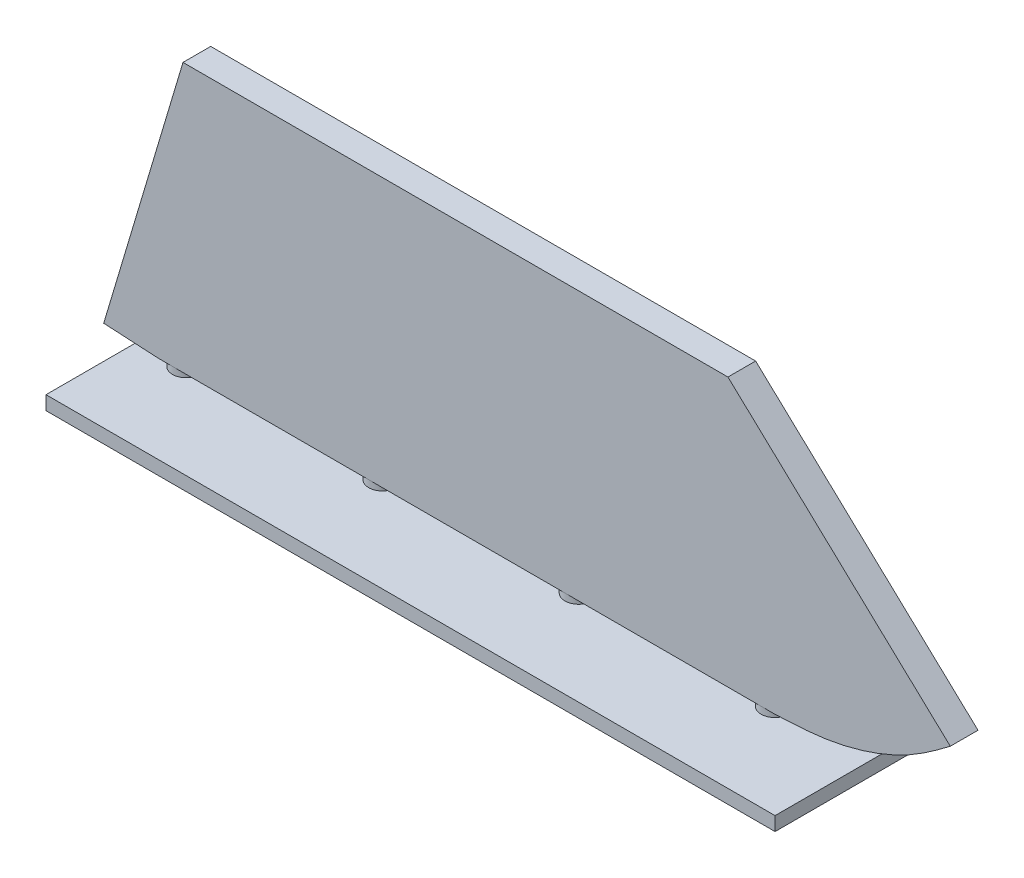
ISO-10303-21;
HEADER;
FILE_DESCRIPTION(('STEP AP214'),'2;1');
FILE_NAME('part.step','',(''),(''),'','','');
FILE_SCHEMA(('AUTOMOTIVE_DESIGN { 1 0 10303 214 1 1 1 1 }'));
ENDSEC;
DATA;
#1=APPLICATION_CONTEXT('core data for automotive mechanical design processes');
#2=APPLICATION_PROTOCOL_DEFINITION('international standard','automotive_design',2000,#1);
#3=PRODUCT_CONTEXT('',#1,'mechanical');
#4=PRODUCT('Part','Part','',(#3));
#5=PRODUCT_RELATED_PRODUCT_CATEGORY('part','',(#4));
#6=PRODUCT_DEFINITION_FORMATION('','',#4);
#7=PRODUCT_DEFINITION_CONTEXT('part definition',#1,'design');
#8=PRODUCT_DEFINITION('design','',#6,#7);
#9=PRODUCT_DEFINITION_SHAPE('','',#8);
#10=(LENGTH_UNIT() NAMED_UNIT(*) SI_UNIT(.MILLI.,.METRE.));
#11=(NAMED_UNIT(*) PLANE_ANGLE_UNIT() SI_UNIT($,.RADIAN.));
#12=(NAMED_UNIT(*) SI_UNIT($,.STERADIAN.) SOLID_ANGLE_UNIT());
#13=UNCERTAINTY_MEASURE_WITH_UNIT(LENGTH_MEASURE(1.E-05),#10,'distance_accuracy_value','');
#14=(GEOMETRIC_REPRESENTATION_CONTEXT(3) GLOBAL_UNCERTAINTY_ASSIGNED_CONTEXT((#13)) GLOBAL_UNIT_ASSIGNED_CONTEXT((#10,
#11,#12)) REPRESENTATION_CONTEXT('',''));
#15=CARTESIAN_POINT('',(0.,0.,0.));
#16=DIRECTION('',(0.,0.,1.));
#17=DIRECTION('',(1.,0.,0.));
#18=AXIS2_PLACEMENT_3D('',#15,#16,#17);
#19=CARTESIAN_POINT('',(14.9148997355209,-5.81721391101612,0.));
#20=DIRECTION('',(0.,-1.,0.));
#21=DIRECTION('',(0.,0.,-1.));
#22=AXIS2_PLACEMENT_3D('',#19,#20,#21);
#23=PLANE('',#22);
#24=DIRECTION('',(1.,0.,0.));
#25=VECTOR('',#24,1.);
#26=CARTESIAN_POINT('',(14.9148997355209,-5.81721391101612,0.));
#27=LINE('',#26,#25);
#28=CARTESIAN_POINT('',(1.60891549915735,-5.81721391101612,0.));
#29=VERTEX_POINT('',#28);
#30=CARTESIAN_POINT('',(10.1089154991573,-5.81721391101612,0.));
#31=VERTEX_POINT('',#30);
#32=EDGE_CURVE('E333',#29,#31,#27,.T.);
#33=ORIENTED_EDGE('',*,*,#32,.T.);
#34=CARTESIAN_POINT('',(10.1089154991573,-5.81721391101612,0.6));
#35=DIRECTION('',(0.,-1.,0.));
#36=DIRECTION('',(0.,0.,-1.));
#37=AXIS2_PLACEMENT_3D('',#34,#35,#36);
#38=CIRCLE('',#37,0.6);
#39=CARTESIAN_POINT('',(10.1089154991573,-5.81721391101612,1.2));
#40=VERTEX_POINT('',#39);
#41=EDGE_CURVE('E113',#40,#31,#38,.T.);
#42=ORIENTED_EDGE('',*,*,#41,.F.);
#43=DIRECTION('',(1.,0.,0.));
#44=VECTOR('',#43,1.);
#45=CARTESIAN_POINT('',(14.9148997355209,-5.81721391101612,1.2));
#46=LINE('',#45,#44);
#47=CARTESIAN_POINT('',(1.60891549915735,-5.81721391101612,1.2));
#48=VERTEX_POINT('',#47);
#49=EDGE_CURVE('E430',#48,#40,#46,.T.);
#50=ORIENTED_EDGE('',*,*,#49,.F.);
#51=CARTESIAN_POINT('',(1.60891549915735,-5.81721391101612,0.6));
#52=DIRECTION('',(0.,-1.,0.));
#53=DIRECTION('',(0.,0.,-1.));
#54=AXIS2_PLACEMENT_3D('',#51,#52,#53);
#55=CIRCLE('',#54,0.6);
#56=EDGE_CURVE('E245',#29,#48,#55,.T.);
#57=ORIENTED_EDGE('',*,*,#56,.F.);
#58=EDGE_LOOP('',(#33,#42,#50,#57));
#59=FACE_BOUND('',#58,.T.);
#60=ADVANCED_FACE('F95',(#59),#23,.T.);
#61=CARTESIAN_POINT('',(-6.89108450084265,-5.81721391101612,0.));
#62=VERTEX_POINT('',#61);
#63=EDGE_CURVE('E341',#62,#29,#27,.T.);
#64=ORIENTED_EDGE('',*,*,#63,.T.);
#65=EDGE_CURVE('E120',#48,#29,#55,.T.);
#66=ORIENTED_EDGE('',*,*,#65,.F.);
#67=CARTESIAN_POINT('',(-6.89108450084265,-5.81721391101612,1.2));
#68=VERTEX_POINT('',#67);
#69=EDGE_CURVE('E428',#68,#48,#46,.T.);
#70=ORIENTED_EDGE('',*,*,#69,.F.);
#71=CARTESIAN_POINT('',(-6.89108450084265,-5.81721391101612,0.6));
#72=DIRECTION('',(0.,-1.,0.));
#73=DIRECTION('',(0.,0.,-1.));
#74=AXIS2_PLACEMENT_3D('',#71,#72,#73);
#75=CIRCLE('',#74,0.6);
#76=EDGE_CURVE('E252',#62,#68,#75,.T.);
#77=ORIENTED_EDGE('',*,*,#76,.F.);
#78=EDGE_LOOP('',(#64,#66,#70,#77));
#79=FACE_BOUND('',#78,.T.);
#80=ADVANCED_FACE('F324',(#79),#23,.T.);
#81=CARTESIAN_POINT('',(-15.3910845008427,-5.81721391101612,0.));
#82=VERTEX_POINT('',#81);
#83=EDGE_CURVE('E279',#82,#62,#27,.T.);
#84=ORIENTED_EDGE('',*,*,#83,.T.);
#85=EDGE_CURVE('E255',#68,#62,#75,.T.);
#86=ORIENTED_EDGE('',*,*,#85,.F.);
#87=CARTESIAN_POINT('',(-15.3910845008427,-5.81721391101612,1.2));
#88=VERTEX_POINT('',#87);
#89=EDGE_CURVE('E382',#88,#68,#46,.T.);
#90=ORIENTED_EDGE('',*,*,#89,.F.);
#91=CARTESIAN_POINT('',(-15.3910845008427,-5.81721391101612,0.6));
#92=DIRECTION('',(0.,-1.,0.));
#93=DIRECTION('',(0.,0.,-1.));
#94=AXIS2_PLACEMENT_3D('',#91,#92,#93);
#95=CIRCLE('',#94,0.6);
#96=EDGE_CURVE('E107',#82,#88,#95,.T.);
#97=ORIENTED_EDGE('',*,*,#96,.F.);
#98=EDGE_LOOP('',(#84,#86,#90,#97));
#99=FACE_BOUND('',#98,.T.);
#100=ADVANCED_FACE('F329',(#99),#23,.T.);
#101=CARTESIAN_POINT('',(10.7230109650848,-5.81721391101612,1.2));
#102=VERTEX_POINT('',#101);
#103=EDGE_CURVE('E377',#40,#102,#46,.T.);
#104=ORIENTED_EDGE('',*,*,#103,.F.);
#105=EDGE_CURVE('E241',#31,#40,#38,.T.);
#106=ORIENTED_EDGE('',*,*,#105,.F.);
#107=CARTESIAN_POINT('',(10.7230109650848,-5.81721391101612,0.));
#108=VERTEX_POINT('',#107);
#109=EDGE_CURVE('E274',#31,#108,#27,.T.);
#110=ORIENTED_EDGE('',*,*,#109,.T.);
#111=DIRECTION('',(0.,0.,1.));
#112=VECTOR('',#111,1.);
#113=CARTESIAN_POINT('',(10.7230109650848,-5.81721391101612,0.));
#114=LINE('',#113,#112);
#115=EDGE_CURVE('E348',#108,#102,#114,.T.);
#116=ORIENTED_EDGE('',*,*,#115,.T.);
#117=EDGE_LOOP('',(#104,#106,#110,#116));
#118=FACE_BOUND('',#117,.T.);
#119=ADVANCED_FACE('F347',(#118),#23,.T.);
#120=CARTESIAN_POINT('',(-15.9910845008427,-5.81721391101612,0.6));
#121=VERTEX_POINT('',#120);
#122=EDGE_CURVE('E12',#88,#121,#95,.T.);
#123=ORIENTED_EDGE('',*,*,#122,.F.);
#124=CARTESIAN_POINT('',(-15.9910845008427,-5.81721391101612,1.2));
#125=VERTEX_POINT('',#124);
#126=EDGE_CURVE('E378',#125,#88,#46,.T.);
#127=ORIENTED_EDGE('',*,*,#126,.F.);
#128=DIRECTION('',(0.,0.,1.));
#129=VECTOR('',#128,1.);
#130=CARTESIAN_POINT('',(-15.9910845008427,-5.81721391101612,0.));
#131=LINE('',#130,#129);
#132=EDGE_CURVE('E369',#121,#125,#131,.T.);
#133=ORIENTED_EDGE('',*,*,#132,.F.);
#134=EDGE_LOOP('',(#123,#127,#133));
#135=FACE_BOUND('',#134,.T.);
#136=ADVANCED_FACE('F304',(#135),#23,.T.);
#137=CARTESIAN_POINT('',(14.9148997355209,-5.56824616303646,0.));
#138=DIRECTION('',(0.,0.,-1.));
#139=DIRECTION('',(-1.,0.,0.));
#140=AXIS2_PLACEMENT_3D('',#137,#138,#139);
#141=PLANE('',#140);
#142=DIRECTION('',(0.99850798449248,-0.0546059054019313,0.));
#143=VECTOR('',#142,1.);
#144=CARTESIAN_POINT('',(14.8091692949579,-7.50160279047393,0.));
#145=LINE('',#144,#143);
#146=CARTESIAN_POINT('',(-18.3712113295862,-5.68705072506922,0.));
#147=VERTEX_POINT('',#146);
#148=CARTESIAN_POINT('',(-15.9910845008427,-5.81721391101612,0.));
#149=VERTEX_POINT('',#148);
#150=EDGE_CURVE('E269',#147,#149,#145,.T.);
#151=ORIENTED_EDGE('',*,*,#150,.F.);
#152=DIRECTION('',(-0.286097759922415,-0.958200434025876,0.));
#153=VECTOR('',#152,1.);
#154=CARTESIAN_POINT('',(-15.6141099919803,3.5470505802458,0.));
#155=LINE('',#154,#153);
#156=CARTESIAN_POINT('',(-14.9362887131247,5.81721391101613,0.));
#157=VERTEX_POINT('',#156);
#158=EDGE_CURVE('E266',#157,#147,#155,.T.);
#159=ORIENTED_EDGE('',*,*,#158,.F.);
#160=DIRECTION('',(-1.,0.,0.));
#161=VECTOR('',#160,1.);
#162=CARTESIAN_POINT('',(14.9148997355209,5.81721391101612,0.));
#163=LINE('',#162,#161);
#164=CARTESIAN_POINT('',(8.67152041767164,5.81721391101612,0.));
#165=VERTEX_POINT('',#164);
#166=EDGE_CURVE('E363',#165,#157,#163,.T.);
#167=ORIENTED_EDGE('',*,*,#166,.F.);
#168=DIRECTION('',(-0.729323810427005,0.68416867769888,0.));
#169=VECTOR('',#168,1.);
#170=CARTESIAN_POINT('',(17.6735790572682,-2.62749400605383,0.));
#171=LINE('',#170,#169);
#172=CARTESIAN_POINT('',(18.3045013913401,-3.21935360649656,0.));
#173=VERTEX_POINT('',#172);
#174=EDGE_CURVE('E286',#173,#165,#171,.T.);
#175=ORIENTED_EDGE('',*,*,#174,.F.);
#176=CARTESIAN_POINT('',(10.7230109650848,-5.81721391101612,0.));
#177=CARTESIAN_POINT('',(11.4066449119743,-5.78645110556188,0.));
#178=CARTESIAN_POINT('',(12.0903144956894,-5.75613160349603,0.));
#179=CARTESIAN_POINT('',(13.4476523289835,-5.57108125666555,0.));
#180=CARTESIAN_POINT('',(14.109804635552,-5.41365512562631,0.));
#181=CARTESIAN_POINT('',(15.0717412312482,-5.09497810633691,0.));
#182=CARTESIAN_POINT('',(15.3878153285094,-4.97510237980859,0.));
#183=CARTESIAN_POINT('',(16.0093075854465,-4.70353288078843,0.));
#184=CARTESIAN_POINT('',(16.3157511566924,-4.55123457448258,0.));
#185=CARTESIAN_POINT('',(17.2086095004276,-4.04008588116487,0.));
#186=CARTESIAN_POINT('',(17.7569931684555,-3.63036393372277,0.));
#187=CARTESIAN_POINT('',(18.3045013913401,-3.21935360649655,0.));
#188=B_SPLINE_CURVE_WITH_KNOTS('',3,(#176,#177,#178,#179,#180,#181,#182,#183,#184,#185,#186,
#187),.UNSPECIFIED.,.F.,.F.,(4,2,2,2,2,4),(0.,0.25,0.5,0.625,0.75,1.),.UNSPECIFIED.);
#189=EDGE_CURVE('E278',#108,#173,#188,.T.);
#190=ORIENTED_EDGE('',*,*,#189,.F.);
#191=ORIENTED_EDGE('',*,*,#109,.F.);
#192=ORIENTED_EDGE('',*,*,#32,.F.);
#193=ORIENTED_EDGE('',*,*,#63,.F.);
#194=ORIENTED_EDGE('',*,*,#83,.F.);
#195=EDGE_CURVE('E275',#149,#82,#27,.T.);
#196=ORIENTED_EDGE('',*,*,#195,.F.);
#197=EDGE_LOOP('',(#151,#159,#167,#175,#190,#191,#192,#193,#194,#196));
#198=FACE_BOUND('',#197,.T.);
#199=ADVANCED_FACE('F97',(#198),#141,.T.);
#200=CARTESIAN_POINT('',(-15.6141099919803,3.5470505802458,0.));
#201=DIRECTION('',(-0.958200434025875,0.286097759922415,0.));
#202=DIRECTION('',(-0.286097759922415,-0.958200434025876,0.));
#203=AXIS2_PLACEMENT_3D('',#200,#201,#202);
#204=PLANE('',#203);
#205=DIRECTION('',(-0.286097759922415,-0.958200434025876,0.));
#206=VECTOR('',#205,1.);
#207=CARTESIAN_POINT('',(-15.6141099919803,3.5470505802458,1.2));
#208=LINE('',#207,#206);
#209=CARTESIAN_POINT('',(-14.9362887131247,5.81721391101613,1.2));
#210=VERTEX_POINT('',#209);
#211=CARTESIAN_POINT('',(-18.3712113295862,-5.68705072506922,1.2));
#212=VERTEX_POINT('',#211);
#213=EDGE_CURVE('E262',#210,#212,#208,.T.);
#214=ORIENTED_EDGE('',*,*,#213,.F.);
#215=DIRECTION('',(0.,0.,1.));
#216=VECTOR('',#215,1.);
#217=CARTESIAN_POINT('',(-14.9362887131247,5.81721391101613,0.));
#218=LINE('',#217,#216);
#219=EDGE_CURVE('E397',#157,#210,#218,.T.);
#220=ORIENTED_EDGE('',*,*,#219,.F.);
#221=ORIENTED_EDGE('',*,*,#158,.T.);
#222=DIRECTION('',(0.,0.,1.));
#223=VECTOR('',#222,1.);
#224=CARTESIAN_POINT('',(-18.3712113295862,-5.68705072506922,0.));
#225=LINE('',#224,#223);
#226=EDGE_CURVE('E99',#147,#212,#225,.T.);
#227=ORIENTED_EDGE('',*,*,#226,.T.);
#228=EDGE_LOOP('',(#214,#220,#221,#227));
#229=FACE_BOUND('',#228,.T.);
#230=ADVANCED_FACE('F309',(#229),#204,.T.);
#231=CARTESIAN_POINT('',(14.9148997355209,5.81721391101612,0.));
#232=DIRECTION('',(0.,1.,0.));
#233=DIRECTION('',(-1.,0.,0.));
#234=AXIS2_PLACEMENT_3D('',#231,#232,#233);
#235=PLANE('',#234);
#236=DIRECTION('',(-1.,0.,0.));
#237=VECTOR('',#236,1.);
#238=CARTESIAN_POINT('',(14.9148997355209,5.81721391101612,1.2));
#239=LINE('',#238,#237);
#240=CARTESIAN_POINT('',(8.67152041767164,5.81721391101612,1.2));
#241=VERTEX_POINT('',#240);
#242=EDGE_CURVE('E270',#241,#210,#239,.T.);
#243=ORIENTED_EDGE('',*,*,#242,.F.);
#244=DIRECTION('',(0.,0.,1.));
#245=VECTOR('',#244,1.);
#246=CARTESIAN_POINT('',(8.67152041767164,5.81721391101612,0.));
#247=LINE('',#246,#245);
#248=EDGE_CURVE('E400',#165,#241,#247,.T.);
#249=ORIENTED_EDGE('',*,*,#248,.F.);
#250=ORIENTED_EDGE('',*,*,#166,.T.);
#251=ORIENTED_EDGE('',*,*,#219,.T.);
#252=EDGE_LOOP('',(#243,#249,#250,#251));
#253=FACE_BOUND('',#252,.T.);
#254=ADVANCED_FACE('F311',(#253),#235,.T.);
#255=CARTESIAN_POINT('',(17.6735790572682,-2.62749400605383,0.));
#256=DIRECTION('',(0.68416867769888,0.729323810427005,0.));
#257=DIRECTION('',(-0.729323810427005,0.68416867769888,0.));
#258=AXIS2_PLACEMENT_3D('',#255,#256,#257);
#259=PLANE('',#258);
#260=DIRECTION('',(-0.729323810427005,0.68416867769888,0.));
#261=VECTOR('',#260,1.);
#262=CARTESIAN_POINT('',(17.6735790572682,-2.62749400605383,1.2));
#263=LINE('',#262,#261);
#264=CARTESIAN_POINT('',(18.3045013913401,-3.21935360649656,1.2));
#265=VERTEX_POINT('',#264);
#266=EDGE_CURVE('E387',#265,#241,#263,.T.);
#267=ORIENTED_EDGE('',*,*,#266,.F.);
#268=DIRECTION('',(0.,0.,1.));
#269=VECTOR('',#268,1.);
#270=CARTESIAN_POINT('',(18.3045013913401,-3.21935360649656,0.));
#271=LINE('',#270,#269);
#272=EDGE_CURVE('E355',#173,#265,#271,.T.);
#273=ORIENTED_EDGE('',*,*,#272,.F.);
#274=ORIENTED_EDGE('',*,*,#174,.T.);
#275=ORIENTED_EDGE('',*,*,#248,.T.);
#276=EDGE_LOOP('',(#267,#273,#274,#275));
#277=FACE_BOUND('',#276,.T.);
#278=ADVANCED_FACE('F297',(#277),#259,.T.);
#279=DIRECTION('',(0.,0.,1.));
#280=VECTOR('',#279,1.);
#281=SURFACE_OF_LINEAR_EXTRUSION('',#188,#280);
#282=CARTESIAN_POINT('',(10.7230109650848,-5.81721391101612,1.2));
#283=CARTESIAN_POINT('',(11.4066449119743,-5.78645110556188,1.2));
#284=CARTESIAN_POINT('',(12.0903144956894,-5.75613160349603,1.2));
#285=CARTESIAN_POINT('',(13.4476523289835,-5.57108125666555,1.2));
#286=CARTESIAN_POINT('',(14.109804635552,-5.41365512562631,1.2));
#287=CARTESIAN_POINT('',(15.0717412312482,-5.09497810633691,1.2));
#288=CARTESIAN_POINT('',(15.3878153285094,-4.97510237980859,1.2));
#289=CARTESIAN_POINT('',(16.0093075854465,-4.70353288078843,1.2));
#290=CARTESIAN_POINT('',(16.3157511566924,-4.55123457448258,1.2));
#291=CARTESIAN_POINT('',(17.2086095004276,-4.04008588116487,1.2));
#292=CARTESIAN_POINT('',(17.7569931684555,-3.63036393372277,1.2));
#293=CARTESIAN_POINT('',(18.3045013913401,-3.21935360649655,1.2));
#294=B_SPLINE_CURVE_WITH_KNOTS('',3,(#282,#283,#284,#285,#286,#287,#288,#289,#290,#291,#292,
#293),.UNSPECIFIED.,.F.,.F.,(4,2,2,2,2,4),(0.,0.25,0.5,0.625,0.75,1.),.UNSPECIFIED.);
#295=EDGE_CURVE('E353',#102,#265,#294,.T.);
#296=ORIENTED_EDGE('',*,*,#295,.F.);
#297=ORIENTED_EDGE('',*,*,#115,.F.);
#298=ORIENTED_EDGE('',*,*,#189,.T.);
#299=ORIENTED_EDGE('',*,*,#272,.T.);
#300=EDGE_LOOP('',(#296,#297,#298,#299));
#301=FACE_BOUND('',#300,.T.);
#302=ADVANCED_FACE('F292',(#301),#281,.T.);
#303=EDGE_CURVE('E105',#121,#82,#95,.T.);
#304=ORIENTED_EDGE('',*,*,#303,.F.);
#305=EDGE_CURVE('E356',#149,#121,#131,.T.);
#306=ORIENTED_EDGE('',*,*,#305,.F.);
#307=ORIENTED_EDGE('',*,*,#195,.T.);
#308=EDGE_LOOP('',(#304,#306,#307));
#309=FACE_BOUND('',#308,.T.);
#310=ADVANCED_FACE('F296',(#309),#23,.T.);
#311=CARTESIAN_POINT('',(14.8091692949579,-7.50160279047393,0.));
#312=DIRECTION('',(-0.0546059054019313,-0.99850798449248,0.));
#313=DIRECTION('',(0.99850798449248,-0.0546059054019313,0.));
#314=AXIS2_PLACEMENT_3D('',#311,#312,#313);
#315=PLANE('',#314);
#316=DIRECTION('',(0.99850798449248,-0.0546059054019313,0.));
#317=VECTOR('',#316,1.);
#318=CARTESIAN_POINT('',(14.8091692949579,-7.50160279047393,1.2));
#319=LINE('',#318,#317);
#320=EDGE_CURVE('E373',#212,#125,#319,.T.);
#321=ORIENTED_EDGE('',*,*,#320,.F.);
#322=ORIENTED_EDGE('',*,*,#226,.F.);
#323=ORIENTED_EDGE('',*,*,#150,.T.);
#324=ORIENTED_EDGE('',*,*,#305,.T.);
#325=ORIENTED_EDGE('',*,*,#132,.T.);
#326=EDGE_LOOP('',(#321,#322,#323,#324,#325));
#327=FACE_BOUND('',#326,.T.);
#328=ADVANCED_FACE('F302',(#327),#315,.T.);
#329=CARTESIAN_POINT('',(14.9148997355209,-5.56824616303646,1.2));
#330=DIRECTION('',(0.,0.,-1.));
#331=DIRECTION('',(-1.,0.,0.));
#332=AXIS2_PLACEMENT_3D('',#329,#330,#331);
#333=PLANE('',#332);
#334=ORIENTED_EDGE('',*,*,#213,.T.);
#335=ORIENTED_EDGE('',*,*,#320,.T.);
#336=ORIENTED_EDGE('',*,*,#126,.T.);
#337=ORIENTED_EDGE('',*,*,#89,.T.);
#338=ORIENTED_EDGE('',*,*,#69,.T.);
#339=ORIENTED_EDGE('',*,*,#49,.T.);
#340=ORIENTED_EDGE('',*,*,#103,.T.);
#341=ORIENTED_EDGE('',*,*,#295,.T.);
#342=ORIENTED_EDGE('',*,*,#266,.T.);
#343=ORIENTED_EDGE('',*,*,#242,.T.);
#344=EDGE_LOOP('',(#334,#335,#336,#337,#338,#339,#340,#341,#342,#343));
#345=FACE_BOUND('',#344,.T.);
#346=ADVANCED_FACE('F307',(#345),#333,.F.);
#347=CARTESIAN_POINT('',(-15.3910845008427,-6.11721391101612,0.6));
#348=DIRECTION('',(0.,1.,0.));
#349=DIRECTION('',(0.,0.,1.));
#350=AXIS2_PLACEMENT_3D('',#347,#348,#349);
#351=CYLINDRICAL_SURFACE('',#350,0.6);
#352=CARTESIAN_POINT('',(-15.3910845008427,-6.11721391101612,0.6));
#353=DIRECTION('',(0.,-1.,0.));
#354=DIRECTION('',(0.,0.,-1.));
#355=AXIS2_PLACEMENT_3D('',#352,#353,#354);
#356=CIRCLE('',#355,0.6);
#357=CARTESIAN_POINT('',(-15.3910845008427,-6.11721391101612,0.));
#358=VERTEX_POINT('',#357);
#359=EDGE_CURVE('E259',#358,#358,#356,.T.);
#360=ORIENTED_EDGE('',*,*,#359,.F.);
#361=EDGE_LOOP('',(#360));
#362=FACE_BOUND('',#361,.T.);
#363=ORIENTED_EDGE('',*,*,#96,.T.);
#364=ORIENTED_EDGE('',*,*,#122,.T.);
#365=ORIENTED_EDGE('',*,*,#303,.T.);
#366=EDGE_LOOP('',(#363,#364,#365));
#367=FACE_BOUND('',#366,.T.);
#368=ADVANCED_FACE('F314',(#362,#367),#351,.T.);
#369=CARTESIAN_POINT('',(-6.89108450084265,-6.11721391101612,0.6));
#370=DIRECTION('',(0.,1.,0.));
#371=DIRECTION('',(0.,0.,1.));
#372=AXIS2_PLACEMENT_3D('',#369,#370,#371);
#373=CYLINDRICAL_SURFACE('',#372,0.6);
#374=CARTESIAN_POINT('',(-6.89108450084265,-6.11721391101612,0.6));
#375=DIRECTION('',(0.,-1.,0.));
#376=DIRECTION('',(0.,0.,-1.));
#377=AXIS2_PLACEMENT_3D('',#374,#375,#376);
#378=CIRCLE('',#377,0.6);
#379=CARTESIAN_POINT('',(-6.89108450084265,-6.11721391101612,0.));
#380=VERTEX_POINT('',#379);
#381=EDGE_CURVE('E248',#380,#380,#378,.T.);
#382=ORIENTED_EDGE('',*,*,#381,.F.);
#383=EDGE_LOOP('',(#382));
#384=FACE_BOUND('',#383,.T.);
#385=ORIENTED_EDGE('',*,*,#76,.T.);
#386=ORIENTED_EDGE('',*,*,#85,.T.);
#387=EDGE_LOOP('',(#385,#386));
#388=FACE_BOUND('',#387,.T.);
#389=ADVANCED_FACE('F319',(#384,#388),#373,.T.);
#390=CARTESIAN_POINT('',(1.60891549915735,-6.11721391101612,0.6));
#391=DIRECTION('',(0.,1.,0.));
#392=DIRECTION('',(0.,0.,1.));
#393=AXIS2_PLACEMENT_3D('',#390,#391,#392);
#394=CYLINDRICAL_SURFACE('',#393,0.6);
#395=CARTESIAN_POINT('',(1.60891549915735,-6.11721391101612,0.6));
#396=DIRECTION('',(0.,-1.,0.));
#397=DIRECTION('',(0.,0.,-1.));
#398=AXIS2_PLACEMENT_3D('',#395,#396,#397);
#399=CIRCLE('',#398,0.6);
#400=CARTESIAN_POINT('',(1.60891549915735,-6.11721391101612,0.));
#401=VERTEX_POINT('',#400);
#402=EDGE_CURVE('E243',#401,#401,#399,.T.);
#403=ORIENTED_EDGE('',*,*,#402,.F.);
#404=EDGE_LOOP('',(#403));
#405=FACE_BOUND('',#404,.T.);
#406=ORIENTED_EDGE('',*,*,#56,.T.);
#407=ORIENTED_EDGE('',*,*,#65,.T.);
#408=EDGE_LOOP('',(#406,#407));
#409=FACE_BOUND('',#408,.T.);
#410=ADVANCED_FACE('F442',(#405,#409),#394,.T.);
#411=CARTESIAN_POINT('',(10.1089154991573,-6.11721391101612,0.6));
#412=DIRECTION('',(0.,1.,0.));
#413=DIRECTION('',(0.,0.,1.));
#414=AXIS2_PLACEMENT_3D('',#411,#412,#413);
#415=CYLINDRICAL_SURFACE('',#414,0.6);
#416=CARTESIAN_POINT('',(10.1089154991573,-6.11721391101612,0.6));
#417=DIRECTION('',(0.,-1.,0.));
#418=DIRECTION('',(0.,0.,-1.));
#419=AXIS2_PLACEMENT_3D('',#416,#417,#418);
#420=CIRCLE('',#419,0.6);
#421=CARTESIAN_POINT('',(10.1089154991573,-6.11721391101612,0.));
#422=VERTEX_POINT('',#421);
#423=EDGE_CURVE('E231',#422,#422,#420,.T.);
#424=ORIENTED_EDGE('',*,*,#423,.F.);
#425=EDGE_LOOP('',(#424));
#426=FACE_BOUND('',#425,.T.);
#427=ORIENTED_EDGE('',*,*,#105,.T.);
#428=ORIENTED_EDGE('',*,*,#41,.T.);
#429=EDGE_LOOP('',(#427,#428));
#430=FACE_BOUND('',#429,.T.);
#431=ADVANCED_FACE('F446',(#426,#430),#415,.T.);
#432=CARTESIAN_POINT('',(-17.3714029187408,-6.71721391101612,4.69968671872242));
#433=DIRECTION('',(1.,0.,0.));
#434=DIRECTION('',(0.,0.,-1.));
#435=AXIS2_PLACEMENT_3D('',#432,#433,#434);
#436=PLANE('',#435);
#437=DIRECTION('',(0.,0.,-1.));
#438=VECTOR('',#437,1.);
#439=CARTESIAN_POINT('',(-17.3714029187408,-6.11721391101612,4.69968671872242));
#440=LINE('',#439,#438);
#441=CARTESIAN_POINT('',(-17.3714029187408,-6.11721391101612,4.69968671872242));
#442=VERTEX_POINT('',#441);
#443=CARTESIAN_POINT('',(-17.3714029187408,-6.11721391101612,-3.10099333914593));
#444=VERTEX_POINT('',#443);
#445=EDGE_CURVE('E229',#442,#444,#440,.T.);
#446=ORIENTED_EDGE('',*,*,#445,.T.);
#447=DIRECTION('',(0.,1.,0.));
#448=VECTOR('',#447,1.);
#449=CARTESIAN_POINT('',(-17.3714029187408,-6.71721391101612,-3.10099333914593));
#450=LINE('',#449,#448);
#451=CARTESIAN_POINT('',(-17.3714029187408,-6.71721391101612,-3.10099333914593));
#452=VERTEX_POINT('',#451);
#453=EDGE_CURVE('E207',#452,#444,#450,.T.);
#454=ORIENTED_EDGE('',*,*,#453,.F.);
#455=DIRECTION('',(0.,0.,-1.));
#456=VECTOR('',#455,1.);
#457=CARTESIAN_POINT('',(-17.3714029187408,-6.71721391101612,4.69968671872242));
#458=LINE('',#457,#456);
#459=CARTESIAN_POINT('',(-17.3714029187408,-6.71721391101612,4.69968671872242));
#460=VERTEX_POINT('',#459);
#461=EDGE_CURVE('E215',#460,#452,#458,.T.);
#462=ORIENTED_EDGE('',*,*,#461,.F.);
#463=DIRECTION('',(0.,1.,0.));
#464=VECTOR('',#463,1.);
#465=CARTESIAN_POINT('',(-17.3714029187408,-6.71721391101612,4.69968671872242));
#466=LINE('',#465,#464);
#467=EDGE_CURVE('E673',#460,#442,#466,.T.);
#468=ORIENTED_EDGE('',*,*,#467,.T.);
#469=EDGE_LOOP('',(#446,#454,#462,#468));
#470=FACE_BOUND('',#469,.T.);
#471=ADVANCED_FACE('F227',(#470),#436,.F.);
#472=CARTESIAN_POINT('',(-17.3714029187408,-6.71721391101612,-3.10099333914593));
#473=DIRECTION('',(0.,0.,1.));
#474=DIRECTION('',(1.,0.,0.));
#475=AXIS2_PLACEMENT_3D('',#472,#473,#474);
#476=PLANE('',#475);
#477=DIRECTION('',(1.,0.,0.));
#478=VECTOR('',#477,1.);
#479=CARTESIAN_POINT('',(-17.3714029187408,-6.11721391101612,-3.10099333914593));
#480=LINE('',#479,#478);
#481=CARTESIAN_POINT('',(14.2126595312391,-6.11721391101612,-3.10099333914593));
#482=VERTEX_POINT('',#481);
#483=EDGE_CURVE('E660',#444,#482,#480,.T.);
#484=ORIENTED_EDGE('',*,*,#483,.T.);
#485=DIRECTION('',(0.,1.,0.));
#486=VECTOR('',#485,1.);
#487=CARTESIAN_POINT('',(14.2126595312391,-6.71721391101612,-3.10099333914593));
#488=LINE('',#487,#486);
#489=CARTESIAN_POINT('',(14.2126595312391,-6.71721391101612,-3.10099333914593));
#490=VERTEX_POINT('',#489);
#491=EDGE_CURVE('E210',#490,#482,#488,.T.);
#492=ORIENTED_EDGE('',*,*,#491,.F.);
#493=DIRECTION('',(1.,0.,0.));
#494=VECTOR('',#493,1.);
#495=CARTESIAN_POINT('',(-17.3714029187408,-6.71721391101612,-3.10099333914593));
#496=LINE('',#495,#494);
#497=EDGE_CURVE('E203',#452,#490,#496,.T.);
#498=ORIENTED_EDGE('',*,*,#497,.F.);
#499=ORIENTED_EDGE('',*,*,#453,.T.);
#500=EDGE_LOOP('',(#484,#492,#498,#499));
#501=FACE_BOUND('',#500,.T.);
#502=ADVANCED_FACE('F205',(#501),#476,.F.);
#503=CARTESIAN_POINT('',(14.2126595312391,-6.71721391101612,4.69968671872242));
#504=DIRECTION('',(-1.,0.,0.));
#505=DIRECTION('',(0.,0.,1.));
#506=AXIS2_PLACEMENT_3D('',#503,#504,#505);
#507=PLANE('',#506);
#508=DIRECTION('',(0.,0.,1.));
#509=VECTOR('',#508,1.);
#510=CARTESIAN_POINT('',(14.2126595312391,-6.11721391101612,4.69968671872242));
#511=LINE('',#510,#509);
#512=CARTESIAN_POINT('',(14.2126595312391,-6.11721391101612,4.69968671872242));
#513=VERTEX_POINT('',#512);
#514=EDGE_CURVE('E664',#482,#513,#511,.T.);
#515=ORIENTED_EDGE('',*,*,#514,.T.);
#516=DIRECTION('',(0.,1.,0.));
#517=VECTOR('',#516,1.);
#518=CARTESIAN_POINT('',(14.2126595312391,-6.71721391101612,4.69968671872242));
#519=LINE('',#518,#517);
#520=CARTESIAN_POINT('',(14.2126595312391,-6.71721391101612,4.69968671872242));
#521=VERTEX_POINT('',#520);
#522=EDGE_CURVE('E237',#521,#513,#519,.T.);
#523=ORIENTED_EDGE('',*,*,#522,.F.);
#524=DIRECTION('',(0.,0.,1.));
#525=VECTOR('',#524,1.);
#526=CARTESIAN_POINT('',(14.2126595312391,-6.71721391101612,4.69968671872242));
#527=LINE('',#526,#525);
#528=EDGE_CURVE('E214',#490,#521,#527,.T.);
#529=ORIENTED_EDGE('',*,*,#528,.F.);
#530=ORIENTED_EDGE('',*,*,#491,.T.);
#531=EDGE_LOOP('',(#515,#523,#529,#530));
#532=FACE_BOUND('',#531,.T.);
#533=ADVANCED_FACE('F455',(#532),#507,.F.);
#534=CARTESIAN_POINT('',(-17.3714029187408,-6.71721391101612,4.69968671872242));
#535=DIRECTION('',(0.,0.,-1.));
#536=DIRECTION('',(-1.,0.,0.));
#537=AXIS2_PLACEMENT_3D('',#534,#535,#536);
#538=PLANE('',#537);
#539=DIRECTION('',(-1.,0.,0.));
#540=VECTOR('',#539,1.);
#541=CARTESIAN_POINT('',(-17.3714029187408,-6.11721391101612,4.69968671872242));
#542=LINE('',#541,#540);
#543=EDGE_CURVE('E225',#513,#442,#542,.T.);
#544=ORIENTED_EDGE('',*,*,#543,.T.);
#545=ORIENTED_EDGE('',*,*,#467,.F.);
#546=DIRECTION('',(-1.,0.,0.));
#547=VECTOR('',#546,1.);
#548=CARTESIAN_POINT('',(-17.3714029187408,-6.71721391101612,4.69968671872242));
#549=LINE('',#548,#547);
#550=EDGE_CURVE('E220',#521,#460,#549,.T.);
#551=ORIENTED_EDGE('',*,*,#550,.F.);
#552=ORIENTED_EDGE('',*,*,#522,.T.);
#553=EDGE_LOOP('',(#544,#545,#551,#552));
#554=FACE_BOUND('',#553,.T.);
#555=ADVANCED_FACE('F458',(#554),#538,.F.);
#556=CARTESIAN_POINT('',(0.,-6.71721391101612,0.));
#557=DIRECTION('',(0.,-1.,0.));
#558=DIRECTION('',(0.,0.,-1.));
#559=AXIS2_PLACEMENT_3D('',#556,#557,#558);
#560=PLANE('',#559);
#561=ORIENTED_EDGE('',*,*,#461,.T.);
#562=ORIENTED_EDGE('',*,*,#497,.T.);
#563=ORIENTED_EDGE('',*,*,#528,.T.);
#564=ORIENTED_EDGE('',*,*,#550,.T.);
#565=EDGE_LOOP('',(#561,#562,#563,#564));
#566=FACE_BOUND('',#565,.T.);
#567=ADVANCED_FACE('F218',(#566),#560,.T.);
#568=CARTESIAN_POINT('',(0.,-6.11721391101612,0.));
#569=DIRECTION('',(0.,-1.,0.));
#570=DIRECTION('',(0.,0.,-1.));
#571=AXIS2_PLACEMENT_3D('',#568,#569,#570);
#572=PLANE('',#571);
#573=ORIENTED_EDGE('',*,*,#359,.T.);
#574=EDGE_LOOP('',(#573));
#575=FACE_BOUND('',#574,.T.);
#576=ORIENTED_EDGE('',*,*,#381,.T.);
#577=EDGE_LOOP('',(#576));
#578=FACE_BOUND('',#577,.T.);
#579=ORIENTED_EDGE('',*,*,#402,.T.);
#580=EDGE_LOOP('',(#579));
#581=FACE_BOUND('',#580,.T.);
#582=ORIENTED_EDGE('',*,*,#423,.T.);
#583=EDGE_LOOP('',(#582));
#584=FACE_BOUND('',#583,.T.);
#585=ORIENTED_EDGE('',*,*,#445,.F.);
#586=ORIENTED_EDGE('',*,*,#543,.F.);
#587=ORIENTED_EDGE('',*,*,#514,.F.);
#588=ORIENTED_EDGE('',*,*,#483,.F.);
#589=EDGE_LOOP('',(#585,#586,#587,#588));
#590=FACE_BOUND('',#589,.T.);
#591=ADVANCED_FACE('F463',(#575,#578,#581,#584,#590),#572,.F.);
#592=CLOSED_SHELL('',(#60,#80,#100,#119,#136,#199,#230,#254,#278,#302,#310,#328,#346,#368,#389,
#410,#431,#471,#502,#533,#555,#567,#591));
#593=MANIFOLD_SOLID_BREP('B2',#592);
#594=ADVANCED_BREP_SHAPE_REPRESENTATION('',(#18,#593),#14);
#595=SHAPE_DEFINITION_REPRESENTATION(#9,#594);
ENDSEC;
END-ISO-10303-21;
